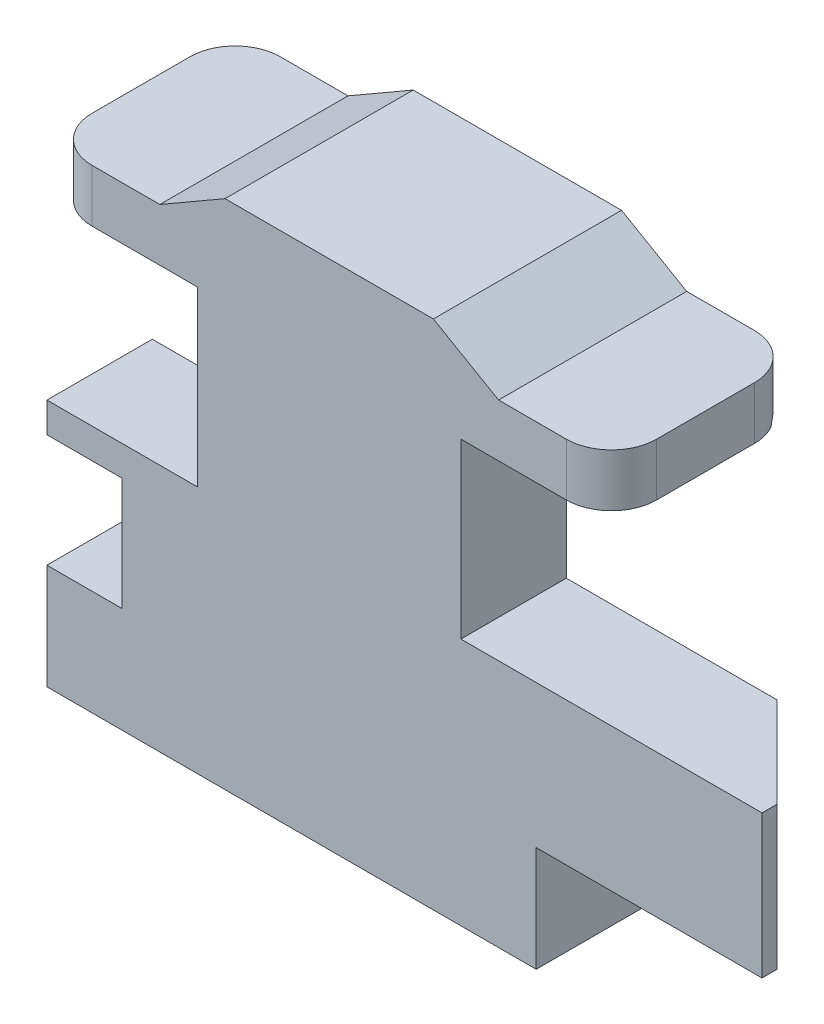
ISO-10303-21;
HEADER;
FILE_DESCRIPTION(('STEP AP214'),'2;1');
FILE_NAME('part.step','',(''),(''),'','','');
FILE_SCHEMA(('AUTOMOTIVE_DESIGN { 1 0 10303 214 1 1 1 1 }'));
ENDSEC;
DATA;
#1=APPLICATION_CONTEXT('core data for automotive mechanical design processes');
#2=APPLICATION_PROTOCOL_DEFINITION('international standard','automotive_design',2000,#1);
#3=PRODUCT_CONTEXT('',#1,'mechanical');
#4=PRODUCT('Part','Part','',(#3));
#5=PRODUCT_RELATED_PRODUCT_CATEGORY('part','',(#4));
#6=PRODUCT_DEFINITION_FORMATION('','',#4);
#7=PRODUCT_DEFINITION_CONTEXT('part definition',#1,'design');
#8=PRODUCT_DEFINITION('design','',#6,#7);
#9=PRODUCT_DEFINITION_SHAPE('','',#8);
#10=(LENGTH_UNIT() NAMED_UNIT(*) SI_UNIT(.MILLI.,.METRE.));
#11=(NAMED_UNIT(*) PLANE_ANGLE_UNIT() SI_UNIT($,.RADIAN.));
#12=(NAMED_UNIT(*) SI_UNIT($,.STERADIAN.) SOLID_ANGLE_UNIT());
#13=UNCERTAINTY_MEASURE_WITH_UNIT(LENGTH_MEASURE(1.E-05),#10,'distance_accuracy_value','');
#14=(GEOMETRIC_REPRESENTATION_CONTEXT(3) GLOBAL_UNCERTAINTY_ASSIGNED_CONTEXT((#13)) GLOBAL_UNIT_ASSIGNED_CONTEXT((#10,
#11,#12)) REPRESENTATION_CONTEXT('',''));
#15=CARTESIAN_POINT('',(0.,0.,0.));
#16=DIRECTION('',(0.,0.,1.));
#17=DIRECTION('',(1.,0.,0.));
#18=AXIS2_PLACEMENT_3D('',#15,#16,#17);
#19=CARTESIAN_POINT('',(-40.6252389627404,0.,0.));
#20=DIRECTION('',(1.,0.,0.));
#21=DIRECTION('',(0.,0.,-1.));
#22=AXIS2_PLACEMENT_3D('',#19,#20,#21);
#23=PLANE('',#22);
#24=DIRECTION('',(0.,0.,-1.));
#25=VECTOR('',#24,1.);
#26=CARTESIAN_POINT('',(-40.6252389627404,5.8,0.));
#27=LINE('',#26,#25);
#28=CARTESIAN_POINT('',(-40.6252389627404,5.8,0.));
#29=VERTEX_POINT('',#28);
#30=CARTESIAN_POINT('',(-40.6252389627404,5.8,-2.8));
#31=VERTEX_POINT('',#30);
#32=EDGE_CURVE('E241',#29,#31,#27,.T.);
#33=ORIENTED_EDGE('',*,*,#32,.F.);
#34=DIRECTION('',(0.,1.,0.));
#35=VECTOR('',#34,1.);
#36=CARTESIAN_POINT('',(-40.6252389627404,6.6,0.));
#37=LINE('',#36,#35);
#38=CARTESIAN_POINT('',(-40.6252389627404,6.6,0.));
#39=VERTEX_POINT('',#38);
#40=EDGE_CURVE('E266',#29,#39,#37,.T.);
#41=ORIENTED_EDGE('',*,*,#40,.T.);
#42=DIRECTION('',(0.,0.,-1.));
#43=VECTOR('',#42,1.);
#44=CARTESIAN_POINT('',(-40.6252389627404,6.6,-2.8));
#45=LINE('',#44,#43);
#46=CARTESIAN_POINT('',(-40.6252389627404,6.6,-2.8));
#47=VERTEX_POINT('',#46);
#48=EDGE_CURVE('E264',#39,#47,#45,.T.);
#49=ORIENTED_EDGE('',*,*,#48,.T.);
#50=DIRECTION('',(0.,-1.,0.));
#51=VECTOR('',#50,1.);
#52=CARTESIAN_POINT('',(-40.6252389627404,0.,-2.8));
#53=LINE('',#52,#51);
#54=EDGE_CURVE('E274',#47,#31,#53,.T.);
#55=ORIENTED_EDGE('',*,*,#54,.T.);
#56=EDGE_LOOP('',(#33,#41,#49,#55));
#57=FACE_BOUND('',#56,.T.);
#58=ADVANCED_FACE('F50',(#57),#23,.F.);
#59=CARTESIAN_POINT('',(-40.6252389627404,2.80000000000004,0.));
#60=DIRECTION('',(0.,0.,1.));
#61=DIRECTION('',(1.,0.,0.));
#62=AXIS2_PLACEMENT_3D('',#59,#60,#61);
#63=PLANE('',#62);
#64=DIRECTION('',(-1.,0.,0.));
#65=VECTOR('',#64,1.);
#66=CARTESIAN_POINT('',(-25.6252389627404,11.2,0.));
#67=LINE('',#66,#65);
#68=CARTESIAN_POINT('',(-26.8252389627404,11.2,0.));
#69=VERTEX_POINT('',#68);
#70=CARTESIAN_POINT('',(-29.6252389627404,11.2,0.));
#71=VERTEX_POINT('',#70);
#72=EDGE_CURVE('E318',#69,#71,#67,.T.);
#73=ORIENTED_EDGE('',*,*,#72,.F.);
#74=DIRECTION('',(0.,-1.,0.));
#75=VECTOR('',#74,1.);
#76=CARTESIAN_POINT('',(-26.8252389627404,12.6,0.));
#77=LINE('',#76,#75);
#78=CARTESIAN_POINT('',(-26.8252389627404,12.6,0.));
#79=VERTEX_POINT('',#78);
#80=EDGE_CURVE('E483',#69,#79,#77,.F.);
#81=ORIENTED_EDGE('',*,*,#80,.T.);
#82=DIRECTION('',(1.,0.,0.));
#83=VECTOR('',#82,1.);
#84=CARTESIAN_POINT('',(-30.3572897703091,12.6,0.));
#85=LINE('',#84,#83);
#86=CARTESIAN_POINT('',(-28.6252389627402,12.6,0.));
#87=VERTEX_POINT('',#86);
#88=EDGE_CURVE('E408',#87,#79,#85,.T.);
#89=ORIENTED_EDGE('',*,*,#88,.F.);
#90=DIRECTION('',(-0.866025403784441,0.499999999999996,0.));
#91=VECTOR('',#90,1.);
#92=CARTESIAN_POINT('',(-33.3817144841967,15.3461524227067,0.));
#93=LINE('',#92,#91);
#94=CARTESIAN_POINT('',(-30.3572897703091,13.6,0.));
#95=VERTEX_POINT('',#94);
#96=EDGE_CURVE('E404',#95,#87,#93,.F.);
#97=ORIENTED_EDGE('',*,*,#96,.F.);
#98=DIRECTION('',(1.,0.,0.));
#99=VECTOR('',#98,1.);
#100=CARTESIAN_POINT('',(-29.6252389627404,13.6,0.));
#101=LINE('',#100,#99);
#102=CARTESIAN_POINT('',(-35.8931881551713,13.6,0.));
#103=VERTEX_POINT('',#102);
#104=EDGE_CURVE('E348',#103,#95,#101,.T.);
#105=ORIENTED_EDGE('',*,*,#104,.F.);
#106=DIRECTION('',(0.866025403784441,0.499999999999996,0.));
#107=VECTOR('',#106,1.);
#108=CARTESIAN_POINT('',(-35.8931881551713,13.6,0.));
#109=LINE('',#108,#107);
#110=CARTESIAN_POINT('',(-37.6252389627402,12.6,0.));
#111=VERTEX_POINT('',#110);
#112=EDGE_CURVE('E424',#103,#111,#109,.F.);
#113=ORIENTED_EDGE('',*,*,#112,.T.);
#114=DIRECTION('',(-1.,0.,0.));
#115=VECTOR('',#114,1.);
#116=CARTESIAN_POINT('',(-35.8931881551713,12.6,0.));
#117=LINE('',#116,#115);
#118=CARTESIAN_POINT('',(-39.4252389627404,12.6,0.));
#119=VERTEX_POINT('',#118);
#120=EDGE_CURVE('E428',#111,#119,#117,.T.);
#121=ORIENTED_EDGE('',*,*,#120,.T.);
#122=DIRECTION('',(0.,1.,0.));
#123=VECTOR('',#122,1.);
#124=CARTESIAN_POINT('',(-39.4252389627404,2.80000000000004,0.));
#125=LINE('',#124,#123);
#126=CARTESIAN_POINT('',(-39.4252389627404,11.2,0.));
#127=VERTEX_POINT('',#126);
#128=EDGE_CURVE('E477',#119,#127,#125,.F.);
#129=ORIENTED_EDGE('',*,*,#128,.T.);
#130=DIRECTION('',(-1.,0.,0.));
#131=VECTOR('',#130,1.);
#132=CARTESIAN_POINT('',(-36.6252389627404,11.2,0.));
#133=LINE('',#132,#131);
#134=CARTESIAN_POINT('',(-36.6252389627404,11.2,0.));
#135=VERTEX_POINT('',#134);
#136=EDGE_CURVE('E337',#135,#127,#133,.T.);
#137=ORIENTED_EDGE('',*,*,#136,.F.);
#138=DIRECTION('',(0.,1.,0.));
#139=VECTOR('',#138,1.);
#140=CARTESIAN_POINT('',(-36.6252389627404,2.80000000000004,0.));
#141=LINE('',#140,#139);
#142=CARTESIAN_POINT('',(-36.6252389627404,6.6,0.));
#143=VERTEX_POINT('',#142);
#144=EDGE_CURVE('E327',#143,#135,#141,.T.);
#145=ORIENTED_EDGE('',*,*,#144,.F.);
#146=DIRECTION('',(1.,0.,0.));
#147=VECTOR('',#146,1.);
#148=CARTESIAN_POINT('',(-40.6252389627404,6.6,0.));
#149=LINE('',#148,#147);
#150=EDGE_CURVE('E287',#39,#143,#149,.T.);
#151=ORIENTED_EDGE('',*,*,#150,.F.);
#152=ORIENTED_EDGE('',*,*,#40,.F.);
#153=DIRECTION('',(1.,0.,0.));
#154=VECTOR('',#153,1.);
#155=CARTESIAN_POINT('',(-40.6252389627404,5.8,0.));
#156=LINE('',#155,#154);
#157=CARTESIAN_POINT('',(-38.6252389627404,5.8,0.));
#158=VERTEX_POINT('',#157);
#159=EDGE_CURVE('E256',#29,#158,#156,.T.);
#160=ORIENTED_EDGE('',*,*,#159,.T.);
#161=DIRECTION('',(0.,-1.,0.));
#162=VECTOR('',#161,1.);
#163=CARTESIAN_POINT('',(-38.6252389627404,5.8,0.));
#164=LINE('',#163,#162);
#165=CARTESIAN_POINT('',(-38.6252389627404,2.8,0.));
#166=VERTEX_POINT('',#165);
#167=EDGE_CURVE('E246',#158,#166,#164,.T.);
#168=ORIENTED_EDGE('',*,*,#167,.T.);
#169=DIRECTION('',(-1.,0.,0.));
#170=VECTOR('',#169,1.);
#171=CARTESIAN_POINT('',(-38.6252389627404,2.8,0.));
#172=LINE('',#171,#170);
#173=CARTESIAN_POINT('',(-40.6252389627404,2.8,0.));
#174=VERTEX_POINT('',#173);
#175=EDGE_CURVE('E240',#166,#174,#172,.T.);
#176=ORIENTED_EDGE('',*,*,#175,.T.);
#177=CARTESIAN_POINT('',(-40.6252389627404,0.,0.));
#178=VERTEX_POINT('',#177);
#179=EDGE_CURVE('E251',#178,#174,#37,.T.);
#180=ORIENTED_EDGE('',*,*,#179,.F.);
#181=DIRECTION('',(-1.,0.,0.));
#182=VECTOR('',#181,1.);
#183=CARTESIAN_POINT('',(-36.6252389627404,0.,0.));
#184=LINE('',#183,#182);
#185=CARTESIAN_POINT('',(-27.6252389627404,0.,0.));
#186=VERTEX_POINT('',#185);
#187=EDGE_CURVE('E299',#186,#178,#184,.T.);
#188=ORIENTED_EDGE('',*,*,#187,.F.);
#189=DIRECTION('',(0.,1.,0.));
#190=VECTOR('',#189,1.);
#191=CARTESIAN_POINT('',(-27.6252389627404,0.,0.));
#192=LINE('',#191,#190);
#193=CARTESIAN_POINT('',(-27.6252389627404,2.80000000000004,0.));
#194=VERTEX_POINT('',#193);
#195=EDGE_CURVE('E305',#186,#194,#192,.T.);
#196=ORIENTED_EDGE('',*,*,#195,.T.);
#197=DIRECTION('',(1.,0.,0.));
#198=VECTOR('',#197,1.);
#199=CARTESIAN_POINT('',(-40.6252389627404,2.80000000000004,0.));
#200=LINE('',#199,#198);
#201=CARTESIAN_POINT('',(-21.6252389627404,2.80000000000004,0.));
#202=VERTEX_POINT('',#201);
#203=EDGE_CURVE('E380',#194,#202,#200,.T.);
#204=ORIENTED_EDGE('',*,*,#203,.T.);
#205=DIRECTION('',(0.,1.,0.));
#206=VECTOR('',#205,1.);
#207=CARTESIAN_POINT('',(-21.6252389627404,2.80000000000004,0.));
#208=LINE('',#207,#206);
#209=CARTESIAN_POINT('',(-21.6252389627404,6.6,0.));
#210=VERTEX_POINT('',#209);
#211=EDGE_CURVE('E394',#202,#210,#208,.T.);
#212=ORIENTED_EDGE('',*,*,#211,.T.);
#213=DIRECTION('',(1.,0.,0.));
#214=VECTOR('',#213,1.);
#215=CARTESIAN_POINT('',(-40.6252389627404,6.6,0.));
#216=LINE('',#215,#214);
#217=CARTESIAN_POINT('',(-29.6252389627404,6.6,0.));
#218=VERTEX_POINT('',#217);
#219=EDGE_CURVE('E369',#218,#210,#216,.T.);
#220=ORIENTED_EDGE('',*,*,#219,.F.);
#221=DIRECTION('',(0.,-1.,0.));
#222=VECTOR('',#221,1.);
#223=CARTESIAN_POINT('',(-29.6252389627404,13.6,0.));
#224=LINE('',#223,#222);
#225=EDGE_CURVE('E359',#71,#218,#224,.T.);
#226=ORIENTED_EDGE('',*,*,#225,.F.);
#227=EDGE_LOOP('',(#73,#81,#89,#97,#105,#113,#121,#129,#137,#145,#151,#152,#160,#168,#176,#180,
#188,#196,#204,#212,#220,#226));
#228=FACE_BOUND('',#227,.T.);
#229=ADVANCED_FACE('F253',(#228),#63,.T.);
#230=CARTESIAN_POINT('',(0.,13.6,0.));
#231=DIRECTION('',(0.,-1.,0.));
#232=DIRECTION('',(0.,0.,-1.));
#233=AXIS2_PLACEMENT_3D('',#230,#231,#232);
#234=PLANE('',#233);
#235=DIRECTION('',(0.,0.,1.));
#236=VECTOR('',#235,1.);
#237=CARTESIAN_POINT('',(-30.3572897703091,13.6,-5.));
#238=LINE('',#237,#236);
#239=CARTESIAN_POINT('',(-30.3572897703091,13.6,-5.));
#240=VERTEX_POINT('',#239);
#241=EDGE_CURVE('E420',#240,#95,#238,.T.);
#242=ORIENTED_EDGE('',*,*,#241,.F.);
#243=DIRECTION('',(1.,0.,0.));
#244=VECTOR('',#243,1.);
#245=CARTESIAN_POINT('',(-29.6252389627404,13.6,-5.));
#246=LINE('',#245,#244);
#247=CARTESIAN_POINT('',(-35.8931881551713,13.6,-5.));
#248=VERTEX_POINT('',#247);
#249=EDGE_CURVE('E322',#248,#240,#246,.T.);
#250=ORIENTED_EDGE('',*,*,#249,.F.);
#251=DIRECTION('',(0.,0.,-1.));
#252=VECTOR('',#251,1.);
#253=CARTESIAN_POINT('',(-35.8931881551713,13.6,0.));
#254=LINE('',#253,#252);
#255=EDGE_CURVE('E433',#103,#248,#254,.T.);
#256=ORIENTED_EDGE('',*,*,#255,.F.);
#257=ORIENTED_EDGE('',*,*,#104,.T.);
#258=EDGE_LOOP('',(#242,#250,#256,#257));
#259=FACE_BOUND('',#258,.T.);
#260=ADVANCED_FACE('F626',(#259),#234,.F.);
#261=CARTESIAN_POINT('',(-40.6252389627404,2.80000000000004,-2.8));
#262=DIRECTION('',(-1.,0.,0.));
#263=DIRECTION('',(0.,0.,1.));
#264=AXIS2_PLACEMENT_3D('',#261,#262,#263);
#265=PLANE('',#264);
#266=DIRECTION('',(0.,0.,-1.));
#267=VECTOR('',#266,1.);
#268=CARTESIAN_POINT('',(-40.6252389627404,12.6,0.));
#269=LINE('',#268,#267);
#270=CARTESIAN_POINT('',(-40.6252389627404,12.6,-1.2));
#271=VERTEX_POINT('',#270);
#272=CARTESIAN_POINT('',(-40.6252389627404,12.6,-3.8));
#273=VERTEX_POINT('',#272);
#274=EDGE_CURVE('E284',#271,#273,#269,.T.);
#275=ORIENTED_EDGE('',*,*,#274,.T.);
#276=DIRECTION('',(0.,1.,0.));
#277=VECTOR('',#276,1.);
#278=CARTESIAN_POINT('',(-40.6252389627404,11.8,-3.8));
#279=LINE('',#278,#277);
#280=CARTESIAN_POINT('',(-40.6252389627404,11.2,-3.8));
#281=VERTEX_POINT('',#280);
#282=EDGE_CURVE('E11',#273,#281,#279,.F.);
#283=ORIENTED_EDGE('',*,*,#282,.T.);
#284=DIRECTION('',(0.,0.,1.));
#285=VECTOR('',#284,1.);
#286=CARTESIAN_POINT('',(-40.6252389627404,11.2,-2.8));
#287=LINE('',#286,#285);
#288=CARTESIAN_POINT('',(-40.6252389627404,11.2,-1.2));
#289=VERTEX_POINT('',#288);
#290=EDGE_CURVE('E345',#281,#289,#287,.T.);
#291=ORIENTED_EDGE('',*,*,#290,.T.);
#292=DIRECTION('',(0.,1.,0.));
#293=VECTOR('',#292,1.);
#294=CARTESIAN_POINT('',(-40.6252389627404,2.80000000000004,-1.2));
#295=LINE('',#294,#293);
#296=EDGE_CURVE('E57',#289,#271,#295,.T.);
#297=ORIENTED_EDGE('',*,*,#296,.T.);
#298=EDGE_LOOP('',(#275,#283,#291,#297));
#299=FACE_BOUND('',#298,.T.);
#300=ADVANCED_FACE('F491',(#299),#265,.T.);
#301=CARTESIAN_POINT('',(0.,0.,-5.));
#302=DIRECTION('',(0.,0.,1.));
#303=DIRECTION('',(1.,0.,0.));
#304=AXIS2_PLACEMENT_3D('',#301,#302,#303);
#305=PLANE('',#304);
#306=DIRECTION('',(1.,0.,0.));
#307=VECTOR('',#306,1.);
#308=CARTESIAN_POINT('',(-30.3572897703091,12.6,-5.));
#309=LINE('',#308,#307);
#310=CARTESIAN_POINT('',(-28.6252389627402,12.6,-5.));
#311=VERTEX_POINT('',#310);
#312=CARTESIAN_POINT('',(-26.8252389627404,12.6,-5.));
#313=VERTEX_POINT('',#312);
#314=EDGE_CURVE('E413',#311,#313,#309,.T.);
#315=ORIENTED_EDGE('',*,*,#314,.T.);
#316=DIRECTION('',(0.,1.,0.));
#317=VECTOR('',#316,1.);
#318=CARTESIAN_POINT('',(-26.8252389627404,0.,-5.));
#319=LINE('',#318,#317);
#320=CARTESIAN_POINT('',(-26.8252389627404,11.8,-5.));
#321=VERTEX_POINT('',#320);
#322=EDGE_CURVE('E459',#313,#321,#319,.F.);
#323=ORIENTED_EDGE('',*,*,#322,.T.);
#324=DIRECTION('',(-1.,0.,0.));
#325=VECTOR('',#324,1.);
#326=CARTESIAN_POINT('',(0.,11.8,-5.));
#327=LINE('',#326,#325);
#328=CARTESIAN_POINT('',(-39.4252389627404,11.8,-5.));
#329=VERTEX_POINT('',#328);
#330=EDGE_CURVE('E397',#321,#329,#327,.T.);
#331=ORIENTED_EDGE('',*,*,#330,.T.);
#332=DIRECTION('',(0.,1.,0.));
#333=VECTOR('',#332,1.);
#334=CARTESIAN_POINT('',(-39.4252389627404,12.6,-5.));
#335=LINE('',#334,#333);
#336=CARTESIAN_POINT('',(-39.4252389627404,12.6,-5.));
#337=VERTEX_POINT('',#336);
#338=EDGE_CURVE('E454',#329,#337,#335,.T.);
#339=ORIENTED_EDGE('',*,*,#338,.T.);
#340=DIRECTION('',(-1.,0.,0.));
#341=VECTOR('',#340,1.);
#342=CARTESIAN_POINT('',(-35.8931881551713,12.6,-5.));
#343=LINE('',#342,#341);
#344=CARTESIAN_POINT('',(-37.6252389627402,12.6,-5.));
#345=VERTEX_POINT('',#344);
#346=EDGE_CURVE('E421',#345,#337,#343,.T.);
#347=ORIENTED_EDGE('',*,*,#346,.F.);
#348=DIRECTION('',(0.866025403784441,0.499999999999996,0.));
#349=VECTOR('',#348,1.);
#350=CARTESIAN_POINT('',(-35.8931881551713,13.6,-5.));
#351=LINE('',#350,#349);
#352=EDGE_CURVE('E419',#248,#345,#351,.F.);
#353=ORIENTED_EDGE('',*,*,#352,.F.);
#354=ORIENTED_EDGE('',*,*,#249,.T.);
#355=DIRECTION('',(-0.866025403784441,0.499999999999996,0.));
#356=VECTOR('',#355,1.);
#357=CARTESIAN_POINT('',(-1.70034969684299,-2.94509206556644,-5.));
#358=LINE('',#357,#356);
#359=EDGE_CURVE('E406',#240,#311,#358,.F.);
#360=ORIENTED_EDGE('',*,*,#359,.T.);
#361=EDGE_LOOP('',(#315,#323,#331,#339,#347,#353,#354,#360));
#362=FACE_BOUND('',#361,.T.);
#363=ADVANCED_FACE('F603',(#362),#305,.F.);
#364=CARTESIAN_POINT('',(-36.6252389627404,2.80000000000004,-2.8));
#365=DIRECTION('',(1.,0.,0.));
#366=DIRECTION('',(0.,0.,-1.));
#367=AXIS2_PLACEMENT_3D('',#364,#365,#366);
#368=PLANE('',#367);
#369=DIRECTION('',(0.,0.,-1.));
#370=VECTOR('',#369,1.);
#371=CARTESIAN_POINT('',(-36.6252389627404,6.6,-2.8));
#372=LINE('',#371,#370);
#373=CARTESIAN_POINT('',(-36.6252389627404,6.6,-2.8));
#374=VERTEX_POINT('',#373);
#375=EDGE_CURVE('E278',#143,#374,#372,.T.);
#376=ORIENTED_EDGE('',*,*,#375,.F.);
#377=ORIENTED_EDGE('',*,*,#144,.T.);
#378=DIRECTION('',(0.,0.,1.));
#379=VECTOR('',#378,1.);
#380=CARTESIAN_POINT('',(-36.6252389627404,11.2,-2.8));
#381=LINE('',#380,#379);
#382=CARTESIAN_POINT('',(-36.6252389627404,11.2,-2.8));
#383=VERTEX_POINT('',#382);
#384=EDGE_CURVE('E333',#383,#135,#381,.T.);
#385=ORIENTED_EDGE('',*,*,#384,.F.);
#386=DIRECTION('',(0.,1.,0.));
#387=VECTOR('',#386,1.);
#388=CARTESIAN_POINT('',(-36.6252389627404,2.80000000000004,-2.8));
#389=LINE('',#388,#387);
#390=EDGE_CURVE('E335',#374,#383,#389,.T.);
#391=ORIENTED_EDGE('',*,*,#390,.F.);
#392=EDGE_LOOP('',(#376,#377,#385,#391));
#393=FACE_BOUND('',#392,.T.);
#394=ADVANCED_FACE('F587',(#393),#368,.F.);
#395=CARTESIAN_POINT('',(0.,2.80000000000004,0.));
#396=DIRECTION('',(0.,1.,0.));
#397=DIRECTION('',(0.,0.,1.));
#398=AXIS2_PLACEMENT_3D('',#395,#396,#397);
#399=PLANE('',#398);
#400=DIRECTION('',(0.,0.,1.));
#401=VECTOR('',#400,1.);
#402=CARTESIAN_POINT('',(-27.6252389627404,2.80000000000004,0.));
#403=LINE('',#402,#401);
#404=CARTESIAN_POINT('',(-27.6252389627404,2.80000000000004,-2.8));
#405=VERTEX_POINT('',#404);
#406=EDGE_CURVE('E295',#405,#194,#403,.T.);
#407=ORIENTED_EDGE('',*,*,#406,.F.);
#408=DIRECTION('',(-1.,0.,0.));
#409=VECTOR('',#408,1.);
#410=CARTESIAN_POINT('',(-24.0252389627404,2.80000000000004,-2.8));
#411=LINE('',#410,#409);
#412=CARTESIAN_POINT('',(-24.0252389627404,2.80000000000004,-2.8));
#413=VERTEX_POINT('',#412);
#414=EDGE_CURVE('E373',#413,#405,#411,.T.);
#415=ORIENTED_EDGE('',*,*,#414,.F.);
#416=DIRECTION('',(-0.707106781186547,0.,-0.707106781186548));
#417=VECTOR('',#416,1.);
#418=CARTESIAN_POINT('',(-21.6252389627404,2.80000000000004,-0.4));
#419=LINE('',#418,#417);
#420=CARTESIAN_POINT('',(-21.6252389627404,2.80000000000004,-0.4));
#421=VERTEX_POINT('',#420);
#422=EDGE_CURVE('E366',#421,#413,#419,.T.);
#423=ORIENTED_EDGE('',*,*,#422,.F.);
#424=DIRECTION('',(0.,0.,-1.));
#425=VECTOR('',#424,1.);
#426=CARTESIAN_POINT('',(-21.6252389627404,2.80000000000004,0.));
#427=LINE('',#426,#425);
#428=EDGE_CURVE('E365',#202,#421,#427,.T.);
#429=ORIENTED_EDGE('',*,*,#428,.F.);
#430=ORIENTED_EDGE('',*,*,#203,.F.);
#431=EDGE_LOOP('',(#407,#415,#423,#429,#430));
#432=FACE_BOUND('',#431,.T.);
#433=ADVANCED_FACE('F567',(#432),#399,.F.);
#434=CARTESIAN_POINT('',(-29.6252389627404,13.6,-2.8));
#435=DIRECTION('',(-1.,0.,0.));
#436=DIRECTION('',(0.,-1.,0.));
#437=AXIS2_PLACEMENT_3D('',#434,#435,#436);
#438=PLANE('',#437);
#439=DIRECTION('',(0.,0.,-1.));
#440=VECTOR('',#439,1.);
#441=CARTESIAN_POINT('',(-29.6252389627404,11.2,-5.));
#442=LINE('',#441,#440);
#443=CARTESIAN_POINT('',(-29.6252389627404,11.2,-2.8));
#444=VERTEX_POINT('',#443);
#445=EDGE_CURVE('E311',#71,#444,#442,.T.);
#446=ORIENTED_EDGE('',*,*,#445,.F.);
#447=ORIENTED_EDGE('',*,*,#225,.T.);
#448=DIRECTION('',(0.,0.,-1.));
#449=VECTOR('',#448,1.);
#450=CARTESIAN_POINT('',(-29.6252389627404,6.6,-2.8));
#451=LINE('',#450,#449);
#452=CARTESIAN_POINT('',(-29.6252389627404,6.6,-2.8));
#453=VERTEX_POINT('',#452);
#454=EDGE_CURVE('E347',#218,#453,#451,.T.);
#455=ORIENTED_EDGE('',*,*,#454,.T.);
#456=DIRECTION('',(0.,-1.,0.));
#457=VECTOR('',#456,1.);
#458=CARTESIAN_POINT('',(-29.6252389627404,13.6,-2.8));
#459=LINE('',#458,#457);
#460=EDGE_CURVE('E354',#444,#453,#459,.T.);
#461=ORIENTED_EDGE('',*,*,#460,.F.);
#462=EDGE_LOOP('',(#446,#447,#455,#461));
#463=FACE_BOUND('',#462,.T.);
#464=ADVANCED_FACE('F585',(#463),#438,.F.);
#465=CARTESIAN_POINT('',(-24.0252389627404,2.80000000000004,-2.8));
#466=DIRECTION('',(0.,0.,-1.));
#467=DIRECTION('',(-1.,0.,0.));
#468=AXIS2_PLACEMENT_3D('',#465,#466,#467);
#469=PLANE('',#468);
#470=DIRECTION('',(-1.,0.,0.));
#471=VECTOR('',#470,1.);
#472=CARTESIAN_POINT('',(-38.6252389627404,2.8,-2.8));
#473=LINE('',#472,#471);
#474=CARTESIAN_POINT('',(-38.6252389627404,2.8,-2.8));
#475=VERTEX_POINT('',#474);
#476=CARTESIAN_POINT('',(-40.6252389627404,2.8,-2.8));
#477=VERTEX_POINT('',#476);
#478=EDGE_CURVE('E238',#475,#477,#473,.T.);
#479=ORIENTED_EDGE('',*,*,#478,.F.);
#480=DIRECTION('',(0.,-1.,0.));
#481=VECTOR('',#480,1.);
#482=CARTESIAN_POINT('',(-38.6252389627404,5.8,-2.8));
#483=LINE('',#482,#481);
#484=CARTESIAN_POINT('',(-38.6252389627404,5.8,-2.8));
#485=VERTEX_POINT('',#484);
#486=EDGE_CURVE('E259',#485,#475,#483,.T.);
#487=ORIENTED_EDGE('',*,*,#486,.F.);
#488=DIRECTION('',(1.,0.,0.));
#489=VECTOR('',#488,1.);
#490=CARTESIAN_POINT('',(-40.6252389627404,5.8,-2.8));
#491=LINE('',#490,#489);
#492=EDGE_CURVE('E529',#31,#485,#491,.T.);
#493=ORIENTED_EDGE('',*,*,#492,.F.);
#494=ORIENTED_EDGE('',*,*,#54,.F.);
#495=DIRECTION('',(1.,0.,0.));
#496=VECTOR('',#495,1.);
#497=CARTESIAN_POINT('',(-40.6252389627404,6.6,-2.8));
#498=LINE('',#497,#496);
#499=EDGE_CURVE('E276',#47,#374,#498,.T.);
#500=ORIENTED_EDGE('',*,*,#499,.T.);
#501=ORIENTED_EDGE('',*,*,#390,.T.);
#502=DIRECTION('',(-1.,0.,0.));
#503=VECTOR('',#502,1.);
#504=CARTESIAN_POINT('',(-40.6252389627404,11.2,-2.8));
#505=LINE('',#504,#503);
#506=EDGE_CURVE('E323',#444,#383,#505,.T.);
#507=ORIENTED_EDGE('',*,*,#506,.F.);
#508=ORIENTED_EDGE('',*,*,#460,.T.);
#509=DIRECTION('',(-1.,0.,0.));
#510=VECTOR('',#509,1.);
#511=CARTESIAN_POINT('',(-24.0252389627404,6.6,-2.8));
#512=LINE('',#511,#510);
#513=CARTESIAN_POINT('',(-24.0252389627404,6.6,-2.8));
#514=VERTEX_POINT('',#513);
#515=EDGE_CURVE('E389',#514,#453,#512,.T.);
#516=ORIENTED_EDGE('',*,*,#515,.F.);
#517=DIRECTION('',(0.,1.,0.));
#518=VECTOR('',#517,1.);
#519=CARTESIAN_POINT('',(-24.0252389627404,2.80000000000004,-2.8));
#520=LINE('',#519,#518);
#521=EDGE_CURVE('E398',#413,#514,#520,.T.);
#522=ORIENTED_EDGE('',*,*,#521,.F.);
#523=ORIENTED_EDGE('',*,*,#414,.T.);
#524=DIRECTION('',(0.,1.,0.));
#525=VECTOR('',#524,1.);
#526=CARTESIAN_POINT('',(-27.6252389627404,0.,-2.8));
#527=LINE('',#526,#525);
#528=CARTESIAN_POINT('',(-27.6252389627404,0.,-2.8));
#529=VERTEX_POINT('',#528);
#530=EDGE_CURVE('E310',#529,#405,#527,.T.);
#531=ORIENTED_EDGE('',*,*,#530,.F.);
#532=DIRECTION('',(1.,0.,0.));
#533=VECTOR('',#532,1.);
#534=CARTESIAN_POINT('',(-27.6252389627404,0.,-2.8));
#535=LINE('',#534,#533);
#536=CARTESIAN_POINT('',(-40.6252389627404,0.,-2.8));
#537=VERTEX_POINT('',#536);
#538=EDGE_CURVE('E291',#537,#529,#535,.T.);
#539=ORIENTED_EDGE('',*,*,#538,.F.);
#540=EDGE_CURVE('E269',#477,#537,#53,.T.);
#541=ORIENTED_EDGE('',*,*,#540,.F.);
#542=EDGE_LOOP('',(#479,#487,#493,#494,#500,#501,#507,#508,#516,#522,#523,#531,#539,#541));
#543=FACE_BOUND('',#542,.T.);
#544=ADVANCED_FACE('F548',(#543),#469,.T.);
#545=CARTESIAN_POINT('',(-21.6252389627404,2.80000000000004,0.));
#546=DIRECTION('',(1.,0.,0.));
#547=DIRECTION('',(0.,0.,-1.));
#548=AXIS2_PLACEMENT_3D('',#545,#546,#547);
#549=PLANE('',#548);
#550=DIRECTION('',(0.,0.,-1.));
#551=VECTOR('',#550,1.);
#552=CARTESIAN_POINT('',(-21.6252389627404,6.6,0.));
#553=LINE('',#552,#551);
#554=CARTESIAN_POINT('',(-21.6252389627404,6.6,-0.4));
#555=VERTEX_POINT('',#554);
#556=EDGE_CURVE('E361',#210,#555,#553,.T.);
#557=ORIENTED_EDGE('',*,*,#556,.F.);
#558=ORIENTED_EDGE('',*,*,#211,.F.);
#559=ORIENTED_EDGE('',*,*,#428,.T.);
#560=DIRECTION('',(0.,1.,0.));
#561=VECTOR('',#560,1.);
#562=CARTESIAN_POINT('',(-21.6252389627404,2.80000000000004,-0.4));
#563=LINE('',#562,#561);
#564=EDGE_CURVE('E379',#421,#555,#563,.T.);
#565=ORIENTED_EDGE('',*,*,#564,.T.);
#566=EDGE_LOOP('',(#557,#558,#559,#565));
#567=FACE_BOUND('',#566,.T.);
#568=ADVANCED_FACE('F571',(#567),#549,.T.);
#569=CARTESIAN_POINT('',(-21.6252389627404,2.80000000000004,-0.4));
#570=DIRECTION('',(0.707106781186548,0.,-0.707106781186547));
#571=DIRECTION('',(-0.707106781186547,0.,-0.707106781186548));
#572=AXIS2_PLACEMENT_3D('',#569,#570,#571);
#573=PLANE('',#572);
#574=DIRECTION('',(-0.707106781186547,0.,-0.707106781186548));
#575=VECTOR('',#574,1.);
#576=CARTESIAN_POINT('',(-21.6252389627404,6.6,-0.4));
#577=LINE('',#576,#575);
#578=EDGE_CURVE('E383',#555,#514,#577,.T.);
#579=ORIENTED_EDGE('',*,*,#578,.F.);
#580=ORIENTED_EDGE('',*,*,#564,.F.);
#581=ORIENTED_EDGE('',*,*,#422,.T.);
#582=ORIENTED_EDGE('',*,*,#521,.T.);
#583=EDGE_LOOP('',(#579,#580,#581,#582));
#584=FACE_BOUND('',#583,.T.);
#585=ADVANCED_FACE('F575',(#584),#573,.T.);
#586=CARTESIAN_POINT('',(0.,6.6,0.));
#587=DIRECTION('',(0.,1.,0.));
#588=DIRECTION('',(0.,0.,1.));
#589=AXIS2_PLACEMENT_3D('',#586,#587,#588);
#590=PLANE('',#589);
#591=ORIENTED_EDGE('',*,*,#454,.F.);
#592=ORIENTED_EDGE('',*,*,#219,.T.);
#593=ORIENTED_EDGE('',*,*,#556,.T.);
#594=ORIENTED_EDGE('',*,*,#578,.T.);
#595=ORIENTED_EDGE('',*,*,#515,.T.);
#596=EDGE_LOOP('',(#591,#592,#593,#594,#595));
#597=FACE_BOUND('',#596,.T.);
#598=ADVANCED_FACE('F579',(#597),#590,.T.);
#599=CARTESIAN_POINT('',(-36.6252389627404,11.2,-2.8));
#600=DIRECTION('',(0.,1.,0.));
#601=DIRECTION('',(0.,0.,1.));
#602=AXIS2_PLACEMENT_3D('',#599,#600,#601);
#603=PLANE('',#602);
#604=DIRECTION('',(1.,0.,0.));
#605=VECTOR('',#604,1.);
#606=CARTESIAN_POINT('',(-36.6252389627404,11.2,-4.4));
#607=LINE('',#606,#605);
#608=CARTESIAN_POINT('',(-40.4644694472817,11.2,-4.4));
#609=VERTEX_POINT('',#608);
#610=CARTESIAN_POINT('',(-25.7860084781991,11.2,-4.4));
#611=VERTEX_POINT('',#610);
#612=EDGE_CURVE('E440',#609,#611,#607,.T.);
#613=ORIENTED_EDGE('',*,*,#612,.T.);
#614=CARTESIAN_POINT('',(-26.8252389627404,11.2,-3.8));
#615=DIRECTION('',(0.,1.,0.));
#616=DIRECTION('',(0.,0.,1.));
#617=AXIS2_PLACEMENT_3D('',#614,#615,#616);
#618=CIRCLE('',#617,1.2);
#619=CARTESIAN_POINT('',(-25.6252389627404,11.2,-3.8));
#620=VERTEX_POINT('',#619);
#621=EDGE_CURVE('E480',#611,#620,#618,.F.);
#622=ORIENTED_EDGE('',*,*,#621,.T.);
#623=DIRECTION('',(0.,0.,-1.));
#624=VECTOR('',#623,1.);
#625=CARTESIAN_POINT('',(-25.6252389627404,11.2,-5.));
#626=LINE('',#625,#624);
#627=CARTESIAN_POINT('',(-25.6252389627404,11.2,-1.2));
#628=VERTEX_POINT('',#627);
#629=EDGE_CURVE('E314',#628,#620,#626,.T.);
#630=ORIENTED_EDGE('',*,*,#629,.F.);
#631=CARTESIAN_POINT('',(-26.8252389627404,11.2,-1.2));
#632=DIRECTION('',(0.,1.,0.));
#633=DIRECTION('',(0.,0.,1.));
#634=AXIS2_PLACEMENT_3D('',#631,#632,#633);
#635=CIRCLE('',#634,1.2);
#636=EDGE_CURVE('E475',#628,#69,#635,.F.);
#637=ORIENTED_EDGE('',*,*,#636,.T.);
#638=ORIENTED_EDGE('',*,*,#72,.T.);
#639=ORIENTED_EDGE('',*,*,#445,.T.);
#640=ORIENTED_EDGE('',*,*,#506,.T.);
#641=ORIENTED_EDGE('',*,*,#384,.T.);
#642=ORIENTED_EDGE('',*,*,#136,.T.);
#643=CARTESIAN_POINT('',(-39.4252389627404,11.2,-1.2));
#644=DIRECTION('',(0.,1.,0.));
#645=DIRECTION('',(0.,0.,1.));
#646=AXIS2_PLACEMENT_3D('',#643,#644,#645);
#647=CIRCLE('',#646,1.2);
#648=EDGE_CURVE('E467',#127,#289,#647,.F.);
#649=ORIENTED_EDGE('',*,*,#648,.T.);
#650=ORIENTED_EDGE('',*,*,#290,.F.);
#651=CARTESIAN_POINT('',(-39.4252389627404,11.2,-3.8));
#652=DIRECTION('',(0.,1.,0.));
#653=DIRECTION('',(0.,0.,1.));
#654=AXIS2_PLACEMENT_3D('',#651,#652,#653);
#655=CIRCLE('',#654,1.2);
#656=EDGE_CURVE('E473',#281,#609,#655,.F.);
#657=ORIENTED_EDGE('',*,*,#656,.T.);
#658=EDGE_LOOP('',(#613,#622,#630,#637,#638,#639,#640,#641,#642,#649,#650,#657));
#659=FACE_BOUND('',#658,.T.);
#660=ADVANCED_FACE('F590',(#659),#603,.F.);
#661=CARTESIAN_POINT('',(-25.6252389627404,0.,0.));
#662=DIRECTION('',(-1.,0.,0.));
#663=DIRECTION('',(0.,0.,1.));
#664=AXIS2_PLACEMENT_3D('',#661,#662,#663);
#665=PLANE('',#664);
#666=ORIENTED_EDGE('',*,*,#629,.T.);
#667=DIRECTION('',(0.,1.,0.));
#668=VECTOR('',#667,1.);
#669=CARTESIAN_POINT('',(-25.6252389627404,0.,-3.8));
#670=LINE('',#669,#668);
#671=CARTESIAN_POINT('',(-25.6252389627404,12.6,-3.8));
#672=VERTEX_POINT('',#671);
#673=EDGE_CURVE('E443',#620,#672,#670,.T.);
#674=ORIENTED_EDGE('',*,*,#673,.T.);
#675=DIRECTION('',(0.,0.,1.));
#676=VECTOR('',#675,1.);
#677=CARTESIAN_POINT('',(-25.6252389627404,12.6,-5.));
#678=LINE('',#677,#676);
#679=CARTESIAN_POINT('',(-25.6252389627404,12.6,-1.2));
#680=VERTEX_POINT('',#679);
#681=EDGE_CURVE('E416',#672,#680,#678,.T.);
#682=ORIENTED_EDGE('',*,*,#681,.T.);
#683=DIRECTION('',(0.,-1.,0.));
#684=VECTOR('',#683,1.);
#685=CARTESIAN_POINT('',(-25.6252389627404,11.2,-1.2));
#686=LINE('',#685,#684);
#687=EDGE_CURVE('E442',#680,#628,#686,.T.);
#688=ORIENTED_EDGE('',*,*,#687,.T.);
#689=EDGE_LOOP('',(#666,#674,#682,#688));
#690=FACE_BOUND('',#689,.T.);
#691=ADVANCED_FACE('F614',(#690),#665,.F.);
#692=CARTESIAN_POINT('',(-27.6252389627404,0.,0.));
#693=DIRECTION('',(-1.,0.,0.));
#694=DIRECTION('',(0.,-1.,0.));
#695=AXIS2_PLACEMENT_3D('',#692,#693,#694);
#696=PLANE('',#695);
#697=ORIENTED_EDGE('',*,*,#406,.T.);
#698=ORIENTED_EDGE('',*,*,#195,.F.);
#699=DIRECTION('',(0.,0.,1.));
#700=VECTOR('',#699,1.);
#701=CARTESIAN_POINT('',(-27.6252389627404,0.,0.));
#702=LINE('',#701,#700);
#703=EDGE_CURVE('E297',#529,#186,#702,.T.);
#704=ORIENTED_EDGE('',*,*,#703,.F.);
#705=ORIENTED_EDGE('',*,*,#530,.T.);
#706=EDGE_LOOP('',(#697,#698,#704,#705));
#707=FACE_BOUND('',#706,.T.);
#708=ADVANCED_FACE('F562',(#707),#696,.F.);
#709=CARTESIAN_POINT('',(0.,0.,0.));
#710=DIRECTION('',(0.,1.,0.));
#711=DIRECTION('',(-1.,0.,0.));
#712=AXIS2_PLACEMENT_3D('',#709,#710,#711);
#713=PLANE('',#712);
#714=ORIENTED_EDGE('',*,*,#187,.T.);
#715=DIRECTION('',(0.,0.,1.));
#716=VECTOR('',#715,1.);
#717=CARTESIAN_POINT('',(-40.6252389627404,0.,0.));
#718=LINE('',#717,#716);
#719=EDGE_CURVE('E263',#537,#178,#718,.T.);
#720=ORIENTED_EDGE('',*,*,#719,.F.);
#721=ORIENTED_EDGE('',*,*,#538,.T.);
#722=ORIENTED_EDGE('',*,*,#703,.T.);
#723=EDGE_LOOP('',(#714,#720,#721,#722));
#724=FACE_BOUND('',#723,.T.);
#725=ADVANCED_FACE('F558',(#724),#713,.F.);
#726=CARTESIAN_POINT('',(-40.6252389627404,6.6,-2.8));
#727=DIRECTION('',(0.,-1.,0.));
#728=DIRECTION('',(0.,0.,-1.));
#729=AXIS2_PLACEMENT_3D('',#726,#727,#728);
#730=PLANE('',#729);
#731=ORIENTED_EDGE('',*,*,#375,.T.);
#732=ORIENTED_EDGE('',*,*,#499,.F.);
#733=ORIENTED_EDGE('',*,*,#48,.F.);
#734=ORIENTED_EDGE('',*,*,#150,.T.);
#735=EDGE_LOOP('',(#731,#732,#733,#734));
#736=FACE_BOUND('',#735,.T.);
#737=ADVANCED_FACE('F656',(#736),#730,.F.);
#738=ORIENTED_EDGE('',*,*,#179,.T.);
#739=DIRECTION('',(0.,0.,-1.));
#740=VECTOR('',#739,1.);
#741=CARTESIAN_POINT('',(-40.6252389627404,2.8,0.));
#742=LINE('',#741,#740);
#743=EDGE_CURVE('E233',#174,#477,#742,.T.);
#744=ORIENTED_EDGE('',*,*,#743,.T.);
#745=ORIENTED_EDGE('',*,*,#540,.T.);
#746=ORIENTED_EDGE('',*,*,#719,.T.);
#747=EDGE_LOOP('',(#738,#744,#745,#746));
#748=FACE_BOUND('',#747,.T.);
#749=ADVANCED_FACE('F261',(#748),#23,.F.);
#750=CARTESIAN_POINT('',(-35.8931881551713,12.6,0.));
#751=DIRECTION('',(0.,-1.,0.));
#752=DIRECTION('',(1.,0.,0.));
#753=AXIS2_PLACEMENT_3D('',#750,#751,#752);
#754=PLANE('',#753);
#755=ORIENTED_EDGE('',*,*,#346,.T.);
#756=CARTESIAN_POINT('',(-39.4252389627404,12.6,-3.8));
#757=DIRECTION('',(0.,-1.,0.));
#758=DIRECTION('',(1.,0.,0.));
#759=AXIS2_PLACEMENT_3D('',#756,#757,#758);
#760=CIRCLE('',#759,1.2);
#761=EDGE_CURVE('E63',#337,#273,#760,.F.);
#762=ORIENTED_EDGE('',*,*,#761,.T.);
#763=ORIENTED_EDGE('',*,*,#274,.F.);
#764=CARTESIAN_POINT('',(-39.4252389627404,12.6,-1.2));
#765=DIRECTION('',(0.,-1.,0.));
#766=DIRECTION('',(1.,0.,0.));
#767=AXIS2_PLACEMENT_3D('',#764,#765,#766);
#768=CIRCLE('',#767,1.2);
#769=EDGE_CURVE('E72',#271,#119,#768,.F.);
#770=ORIENTED_EDGE('',*,*,#769,.T.);
#771=ORIENTED_EDGE('',*,*,#120,.F.);
#772=DIRECTION('',(0.,0.,1.));
#773=VECTOR('',#772,1.);
#774=CARTESIAN_POINT('',(-37.6252389627402,12.6,0.));
#775=LINE('',#774,#773);
#776=EDGE_CURVE('E427',#111,#345,#775,.F.);
#777=ORIENTED_EDGE('',*,*,#776,.T.);
#778=EDGE_LOOP('',(#755,#762,#763,#770,#771,#777));
#779=FACE_BOUND('',#778,.T.);
#780=ADVANCED_FACE('F494',(#779),#754,.F.);
#781=CARTESIAN_POINT('',(-35.8931881551713,13.6,0.));
#782=DIRECTION('',(-0.499999999999996,0.866025403784441,0.));
#783=DIRECTION('',(0.866025403784441,0.499999999999996,0.));
#784=AXIS2_PLACEMENT_3D('',#781,#782,#783);
#785=PLANE('',#784);
#786=ORIENTED_EDGE('',*,*,#352,.T.);
#787=ORIENTED_EDGE('',*,*,#776,.F.);
#788=ORIENTED_EDGE('',*,*,#112,.F.);
#789=ORIENTED_EDGE('',*,*,#255,.T.);
#790=EDGE_LOOP('',(#786,#787,#788,#789));
#791=FACE_BOUND('',#790,.T.);
#792=ADVANCED_FACE('F635',(#791),#785,.T.);
#793=CARTESIAN_POINT('',(-30.3572897703091,12.6,-5.));
#794=DIRECTION('',(0.,-1.,0.));
#795=DIRECTION('',(1.,0.,0.));
#796=AXIS2_PLACEMENT_3D('',#793,#794,#795);
#797=PLANE('',#796);
#798=ORIENTED_EDGE('',*,*,#681,.F.);
#799=CARTESIAN_POINT('',(-26.8252389627404,12.6,-3.8));
#800=DIRECTION('',(0.,-1.,0.));
#801=DIRECTION('',(1.,0.,0.));
#802=AXIS2_PLACEMENT_3D('',#799,#800,#801);
#803=CIRCLE('',#802,1.2);
#804=EDGE_CURVE('E455',#672,#313,#803,.F.);
#805=ORIENTED_EDGE('',*,*,#804,.T.);
#806=ORIENTED_EDGE('',*,*,#314,.F.);
#807=DIRECTION('',(0.,0.,-1.));
#808=VECTOR('',#807,1.);
#809=CARTESIAN_POINT('',(-28.6252389627402,12.6,-5.));
#810=LINE('',#809,#808);
#811=EDGE_CURVE('E414',#311,#87,#810,.F.);
#812=ORIENTED_EDGE('',*,*,#811,.T.);
#813=ORIENTED_EDGE('',*,*,#88,.T.);
#814=CARTESIAN_POINT('',(-26.8252389627404,12.6,-1.2));
#815=DIRECTION('',(0.,-1.,0.));
#816=DIRECTION('',(1.,0.,0.));
#817=AXIS2_PLACEMENT_3D('',#814,#815,#816);
#818=CIRCLE('',#817,1.2);
#819=EDGE_CURVE('E449',#79,#680,#818,.F.);
#820=ORIENTED_EDGE('',*,*,#819,.T.);
#821=EDGE_LOOP('',(#798,#805,#806,#812,#813,#820));
#822=FACE_BOUND('',#821,.T.);
#823=ADVANCED_FACE('F624',(#822),#797,.F.);
#824=CARTESIAN_POINT('',(-30.3572897703091,13.6,-5.));
#825=DIRECTION('',(0.499999999999996,0.866025403784441,0.));
#826=DIRECTION('',(-0.866025403784441,0.499999999999996,0.));
#827=AXIS2_PLACEMENT_3D('',#824,#825,#826);
#828=PLANE('',#827);
#829=ORIENTED_EDGE('',*,*,#96,.T.);
#830=ORIENTED_EDGE('',*,*,#811,.F.);
#831=ORIENTED_EDGE('',*,*,#359,.F.);
#832=ORIENTED_EDGE('',*,*,#241,.T.);
#833=EDGE_LOOP('',(#829,#830,#831,#832));
#834=FACE_BOUND('',#833,.T.);
#835=ADVANCED_FACE('F627',(#834),#828,.T.);
#836=CARTESIAN_POINT('',(-38.6252389627404,2.8,0.));
#837=DIRECTION('',(0.,-1.,0.));
#838=DIRECTION('',(0.,0.,-1.));
#839=AXIS2_PLACEMENT_3D('',#836,#837,#838);
#840=PLANE('',#839);
#841=ORIENTED_EDGE('',*,*,#478,.T.);
#842=ORIENTED_EDGE('',*,*,#743,.F.);
#843=ORIENTED_EDGE('',*,*,#175,.F.);
#844=DIRECTION('',(0.,0.,-1.));
#845=VECTOR('',#844,1.);
#846=CARTESIAN_POINT('',(-38.6252389627404,2.8,0.));
#847=LINE('',#846,#845);
#848=EDGE_CURVE('E409',#166,#475,#847,.T.);
#849=ORIENTED_EDGE('',*,*,#848,.T.);
#850=EDGE_LOOP('',(#841,#842,#843,#849));
#851=FACE_BOUND('',#850,.T.);
#852=ADVANCED_FACE('F237',(#851),#840,.F.);
#853=CARTESIAN_POINT('',(-38.6252389627404,5.8,0.));
#854=DIRECTION('',(1.,0.,0.));
#855=DIRECTION('',(0.,0.,-1.));
#856=AXIS2_PLACEMENT_3D('',#853,#854,#855);
#857=PLANE('',#856);
#858=ORIENTED_EDGE('',*,*,#486,.T.);
#859=ORIENTED_EDGE('',*,*,#848,.F.);
#860=ORIENTED_EDGE('',*,*,#167,.F.);
#861=DIRECTION('',(0.,0.,-1.));
#862=VECTOR('',#861,1.);
#863=CARTESIAN_POINT('',(-38.6252389627404,5.8,0.));
#864=LINE('',#863,#862);
#865=EDGE_CURVE('E521',#158,#485,#864,.T.);
#866=ORIENTED_EDGE('',*,*,#865,.T.);
#867=EDGE_LOOP('',(#858,#859,#860,#866));
#868=FACE_BOUND('',#867,.T.);
#869=ADVANCED_FACE('F555',(#868),#857,.F.);
#870=CARTESIAN_POINT('',(-40.6252389627404,5.8,0.));
#871=DIRECTION('',(0.,1.,0.));
#872=DIRECTION('',(0.,0.,1.));
#873=AXIS2_PLACEMENT_3D('',#870,#871,#872);
#874=PLANE('',#873);
#875=ORIENTED_EDGE('',*,*,#492,.T.);
#876=ORIENTED_EDGE('',*,*,#865,.F.);
#877=ORIENTED_EDGE('',*,*,#159,.F.);
#878=ORIENTED_EDGE('',*,*,#32,.T.);
#879=EDGE_LOOP('',(#875,#876,#877,#878));
#880=FACE_BOUND('',#879,.T.);
#881=ADVANCED_FACE('F545',(#880),#874,.F.);
#882=CARTESIAN_POINT('',(0.,11.8,-5.));
#883=DIRECTION('',(0.,0.707106781186548,0.707106781186548));
#884=DIRECTION('',(-1.,0.,0.));
#885=AXIS2_PLACEMENT_3D('',#882,#883,#884);
#886=PLANE('',#885);
#887=ORIENTED_EDGE('',*,*,#330,.F.);
#888=CARTESIAN_POINT('',(-26.8252389627404,10.6,-3.8));
#889=DIRECTION('',(0.,0.707106781186548,0.707106781186548));
#890=DIRECTION('',(0.,0.707106781186548,-0.707106781186548));
#891=AXIS2_PLACEMENT_3D('',#888,#889,#890);
#892=ELLIPSE('',#891,1.69705627484771,1.2);
#893=EDGE_CURVE('E461',#321,#611,#892,.F.);
#894=ORIENTED_EDGE('',*,*,#893,.T.);
#895=ORIENTED_EDGE('',*,*,#612,.F.);
#896=CARTESIAN_POINT('',(-39.4252389627404,10.6,-3.8));
#897=DIRECTION('',(0.,0.707106781186548,0.707106781186548));
#898=DIRECTION('',(0.,-0.707106781186548,0.707106781186548));
#899=AXIS2_PLACEMENT_3D('',#896,#897,#898);
#900=ELLIPSE('',#899,1.69705627484771,1.2);
#901=EDGE_CURVE('E465',#609,#329,#900,.F.);
#902=ORIENTED_EDGE('',*,*,#901,.T.);
#903=EDGE_LOOP('',(#887,#894,#895,#902));
#904=FACE_BOUND('',#903,.T.);
#905=ADVANCED_FACE('F601',(#904),#886,.F.);
#906=CARTESIAN_POINT('',(-26.8252389627404,0.,-3.8));
#907=DIRECTION('',(0.,1.,0.));
#908=DIRECTION('',(0.,0.,1.));
#909=AXIS2_PLACEMENT_3D('',#906,#907,#908);
#910=CYLINDRICAL_SURFACE('',#909,1.2);
#911=ORIENTED_EDGE('',*,*,#893,.F.);
#912=ORIENTED_EDGE('',*,*,#322,.F.);
#913=ORIENTED_EDGE('',*,*,#804,.F.);
#914=ORIENTED_EDGE('',*,*,#673,.F.);
#915=ORIENTED_EDGE('',*,*,#621,.F.);
#916=EDGE_LOOP('',(#911,#912,#913,#914,#915));
#917=FACE_BOUND('',#916,.T.);
#918=ADVANCED_FACE('F606',(#917),#910,.T.);
#919=CARTESIAN_POINT('',(-26.8252389627404,0.,-1.2));
#920=DIRECTION('',(0.,1.,0.));
#921=DIRECTION('',(0.,0.,1.));
#922=AXIS2_PLACEMENT_3D('',#919,#920,#921);
#923=CYLINDRICAL_SURFACE('',#922,1.2);
#924=ORIENTED_EDGE('',*,*,#819,.F.);
#925=ORIENTED_EDGE('',*,*,#80,.F.);
#926=ORIENTED_EDGE('',*,*,#636,.F.);
#927=ORIENTED_EDGE('',*,*,#687,.F.);
#928=EDGE_LOOP('',(#924,#925,#926,#927));
#929=FACE_BOUND('',#928,.T.);
#930=ADVANCED_FACE('F618',(#929),#923,.T.);
#931=CARTESIAN_POINT('',(-39.4252389627404,0.,-3.8));
#932=DIRECTION('',(0.,-1.,0.));
#933=DIRECTION('',(0.,0.,-1.));
#934=AXIS2_PLACEMENT_3D('',#931,#932,#933);
#935=CYLINDRICAL_SURFACE('',#934,1.2);
#936=ORIENTED_EDGE('',*,*,#656,.F.);
#937=ORIENTED_EDGE('',*,*,#282,.F.);
#938=ORIENTED_EDGE('',*,*,#761,.F.);
#939=ORIENTED_EDGE('',*,*,#338,.F.);
#940=ORIENTED_EDGE('',*,*,#901,.F.);
#941=EDGE_LOOP('',(#936,#937,#938,#939,#940));
#942=FACE_BOUND('',#941,.T.);
#943=ADVANCED_FACE('F600',(#942),#935,.T.);
#944=CARTESIAN_POINT('',(-39.4252389627404,2.80000000000004,-1.2));
#945=DIRECTION('',(0.,1.,0.));
#946=DIRECTION('',(0.,0.,1.));
#947=AXIS2_PLACEMENT_3D('',#944,#945,#946);
#948=CYLINDRICAL_SURFACE('',#947,1.2);
#949=ORIENTED_EDGE('',*,*,#648,.F.);
#950=ORIENTED_EDGE('',*,*,#128,.F.);
#951=ORIENTED_EDGE('',*,*,#769,.F.);
#952=ORIENTED_EDGE('',*,*,#296,.F.);
#953=EDGE_LOOP('',(#949,#950,#951,#952));
#954=FACE_BOUND('',#953,.T.);
#955=ADVANCED_FACE('F47',(#954),#948,.T.);
#956=CLOSED_SHELL('',(#58,#229,#260,#300,#363,#394,#433,#464,#544,#568,#585,#598,#660,#691,#708,
#725,#737,#749,#780,#792,#823,#835,#852,#869,#881,#905,#918,#930,#943,#955));
#957=MANIFOLD_SOLID_BREP('B2',#956);
#958=ADVANCED_BREP_SHAPE_REPRESENTATION('',(#18,#957),#14);
#959=SHAPE_DEFINITION_REPRESENTATION(#9,#958);
ENDSEC;
END-ISO-10303-21;
